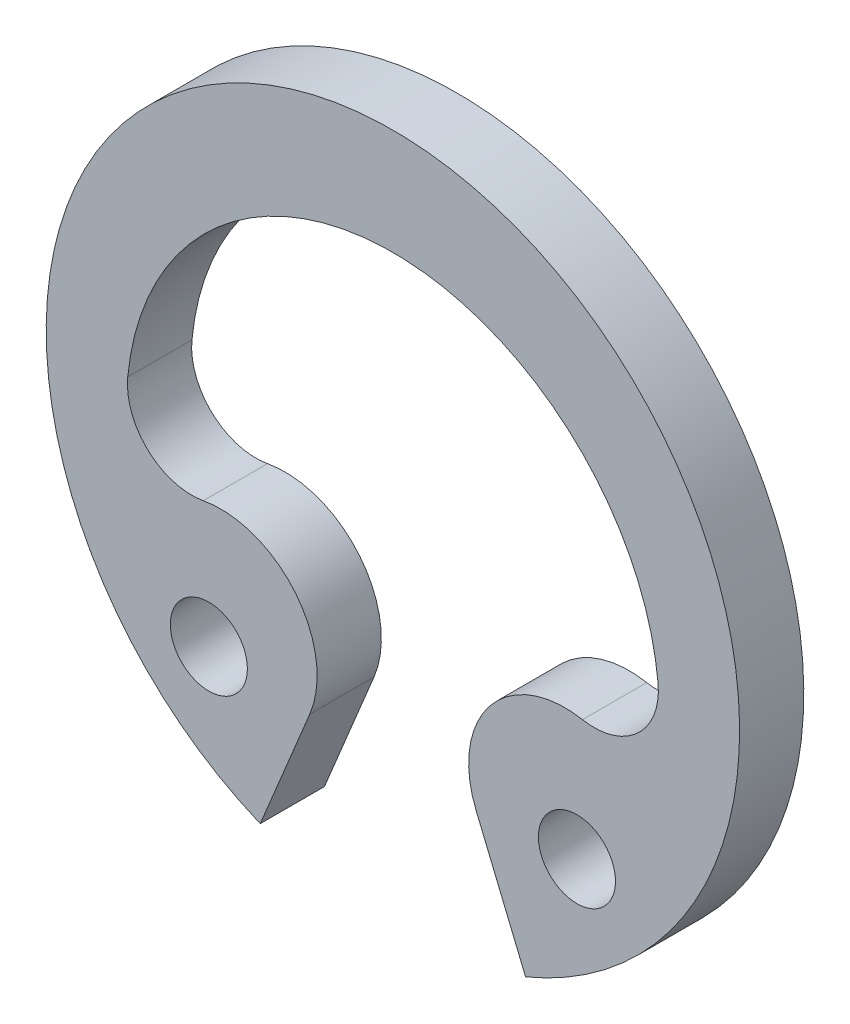
ISO-10303-21;
HEADER;
FILE_DESCRIPTION(('STEP AP214'),'2;1');
FILE_NAME('part.step','',(''),(''),'','','');
FILE_SCHEMA(('AUTOMOTIVE_DESIGN { 1 0 10303 214 1 1 1 1 }'));
ENDSEC;
DATA;
#1=APPLICATION_CONTEXT('core data for automotive mechanical design processes');
#2=APPLICATION_PROTOCOL_DEFINITION('international standard','automotive_design',2000,#1);
#3=PRODUCT_CONTEXT('',#1,'mechanical');
#4=PRODUCT('Part','Part','',(#3));
#5=PRODUCT_RELATED_PRODUCT_CATEGORY('part','',(#4));
#6=PRODUCT_DEFINITION_FORMATION('','',#4);
#7=PRODUCT_DEFINITION_CONTEXT('part definition',#1,'design');
#8=PRODUCT_DEFINITION('design','',#6,#7);
#9=PRODUCT_DEFINITION_SHAPE('','',#8);
#10=(LENGTH_UNIT() NAMED_UNIT(*) SI_UNIT(.MILLI.,.METRE.));
#11=(NAMED_UNIT(*) PLANE_ANGLE_UNIT() SI_UNIT($,.RADIAN.));
#12=(NAMED_UNIT(*) SI_UNIT($,.STERADIAN.) SOLID_ANGLE_UNIT());
#13=UNCERTAINTY_MEASURE_WITH_UNIT(LENGTH_MEASURE(1.E-05),#10,'distance_accuracy_value','');
#14=(GEOMETRIC_REPRESENTATION_CONTEXT(3) GLOBAL_UNCERTAINTY_ASSIGNED_CONTEXT((#13)) GLOBAL_UNIT_ASSIGNED_CONTEXT((#10,
#11,#12)) REPRESENTATION_CONTEXT('',''));
#15=CARTESIAN_POINT('',(0.,0.,0.));
#16=DIRECTION('',(0.,0.,1.));
#17=DIRECTION('',(1.,0.,0.));
#18=AXIS2_PLACEMENT_3D('',#15,#16,#17);
#19=CARTESIAN_POINT('',(-2.6801721145065,-2.55081897370664,1.));
#20=DIRECTION('',(0.,0.,1.));
#21=DIRECTION('',(1.,0.,0.));
#22=AXIS2_PLACEMENT_3D('',#19,#20,#21);
#23=PLANE('',#22);
#24=CARTESIAN_POINT('',(-2.86658661990223,-3.00086340085608,1.));
#25=DIRECTION('',(0.,0.,1.));
#26=DIRECTION('',(1.,0.,0.));
#27=AXIS2_PLACEMENT_3D('',#24,#25,#26);
#28=CIRCLE('',#27,0.6);
#29=CARTESIAN_POINT('',(-2.26658661990223,-3.00086340085608,1.));
#30=VERTEX_POINT('',#29);
#31=EDGE_CURVE('E144',#30,#30,#28,.T.);
#32=ORIENTED_EDGE('',*,*,#31,.F.);
#33=EDGE_LOOP('',(#32));
#34=FACE_BOUND('',#33,.T.);
#35=CARTESIAN_POINT('',(-2.6801721145065,-2.55081897370664,1.));
#36=DIRECTION('',(0.,0.,1.));
#37=DIRECTION('',(1.,0.,0.));
#38=AXIS2_PLACEMENT_3D('',#35,#36,#37);
#39=CIRCLE('',#38,1.5);
#40=CARTESIAN_POINT('',(-1.29435281573957,-3.12484412225427,1.));
#41=VERTEX_POINT('',#40);
#42=CARTESIAN_POINT('',(-2.95304387956165,-1.07584744861347,1.));
#43=VERTEX_POINT('',#42);
#44=EDGE_CURVE('E157',#41,#43,#39,.T.);
#45=ORIENTED_EDGE('',*,*,#44,.T.);
#46=CARTESIAN_POINT('',(-3.13495838959842,-0.0925330985513534,1.));
#47=DIRECTION('',(0.,0.,-1.));
#48=DIRECTION('',(-1.,0.,0.));
#49=AXIS2_PLACEMENT_3D('',#46,#47,#48);
#50=CIRCLE('',#49,0.999999999999996);
#51=CARTESIAN_POINT('',(-4.13018327518522,0.00507544159107008,1.));
#52=VERTEX_POINT('',#51);
#53=EDGE_CURVE('E103',#43,#52,#50,.T.);
#54=ORIENTED_EDGE('',*,*,#53,.T.);
#55=CARTESIAN_POINT('',(0.,-0.4,1.));
#56=DIRECTION('',(0.,0.,-1.));
#57=DIRECTION('',(1.,0.,0.));
#58=AXIS2_PLACEMENT_3D('',#55,#56,#57);
#59=CIRCLE('',#58,4.15);
#60=CARTESIAN_POINT('',(4.13018327518524,0.00507544159106942,1.));
#61=VERTEX_POINT('',#60);
#62=EDGE_CURVE('E172',#52,#61,#59,.T.);
#63=ORIENTED_EDGE('',*,*,#62,.T.);
#64=CARTESIAN_POINT('',(3.13495838959844,-0.0925330985513534,1.));
#65=DIRECTION('',(0.,0.,-1.));
#66=DIRECTION('',(1.,0.,0.));
#67=AXIS2_PLACEMENT_3D('',#64,#65,#66);
#68=CIRCLE('',#67,0.999999999999995);
#69=CARTESIAN_POINT('',(2.95304387956167,-1.07584744861347,1.));
#70=VERTEX_POINT('',#69);
#71=EDGE_CURVE('E185',#61,#70,#68,.T.);
#72=ORIENTED_EDGE('',*,*,#71,.T.);
#73=CARTESIAN_POINT('',(2.68017211450651,-2.55081897370664,1.));
#74=DIRECTION('',(0.,0.,1.));
#75=DIRECTION('',(-1.,0.,0.));
#76=AXIS2_PLACEMENT_3D('',#73,#74,#75);
#77=CIRCLE('',#76,1.5);
#78=CARTESIAN_POINT('',(1.29435281573959,-3.12484412225428,1.));
#79=VERTEX_POINT('',#78);
#80=EDGE_CURVE('E122',#70,#79,#77,.T.);
#81=ORIENTED_EDGE('',*,*,#80,.T.);
#82=DIRECTION('',(0.382683432365093,-0.923879532511285,0.));
#83=VECTOR('',#82,1.);
#84=CARTESIAN_POINT('',(1.29435281573959,-3.12484412225428,1.));
#85=LINE('',#84,#83);
#86=CARTESIAN_POINT('',(2.0664905347715,-4.98894947556094,1.));
#87=VERTEX_POINT('',#86);
#88=EDGE_CURVE('E116',#79,#87,#85,.T.);
#89=ORIENTED_EDGE('',*,*,#88,.T.);
#90=CARTESIAN_POINT('',(0.,0.,1.));
#91=DIRECTION('',(0.,0.,1.));
#92=DIRECTION('',(1.,0.,0.));
#93=AXIS2_PLACEMENT_3D('',#90,#91,#92);
#94=CIRCLE('',#93,5.4);
#95=CARTESIAN_POINT('',(-2.06649053477149,-4.98894947556095,1.));
#96=VERTEX_POINT('',#95);
#97=EDGE_CURVE('E120',#87,#96,#94,.T.);
#98=ORIENTED_EDGE('',*,*,#97,.T.);
#99=DIRECTION('',(0.382683432365091,0.923879532511286,0.));
#100=VECTOR('',#99,1.);
#101=CARTESIAN_POINT('',(-1.29435281573957,-3.12484412225427,1.));
#102=LINE('',#101,#100);
#103=EDGE_CURVE('E60',#96,#41,#102,.T.);
#104=ORIENTED_EDGE('',*,*,#103,.T.);
#105=EDGE_LOOP('',(#45,#54,#63,#72,#81,#89,#98,#104));
#106=FACE_BOUND('',#105,.T.);
#107=CARTESIAN_POINT('',(2.86658661990224,-3.00086340085608,1.));
#108=DIRECTION('',(0.,0.,1.));
#109=DIRECTION('',(-1.,0.,0.));
#110=AXIS2_PLACEMENT_3D('',#107,#108,#109);
#111=CIRCLE('',#110,0.6);
#112=CARTESIAN_POINT('',(2.26658661990224,-3.00086340085608,1.));
#113=VERTEX_POINT('',#112);
#114=EDGE_CURVE('E195',#113,#113,#111,.T.);
#115=ORIENTED_EDGE('',*,*,#114,.F.);
#116=EDGE_LOOP('',(#115));
#117=FACE_BOUND('',#116,.T.);
#118=ADVANCED_FACE('F43',(#34,#106,#117),#23,.T.);
#119=CARTESIAN_POINT('',(-2.6801721145065,-2.55081897370664,0.));
#120=DIRECTION('',(0.,0.,1.));
#121=DIRECTION('',(1.,0.,0.));
#122=AXIS2_PLACEMENT_3D('',#119,#120,#121);
#123=PLANE('',#122);
#124=CARTESIAN_POINT('',(-2.6801721145065,-2.55081897370664,0.));
#125=DIRECTION('',(0.,0.,1.));
#126=DIRECTION('',(1.,0.,0.));
#127=AXIS2_PLACEMENT_3D('',#124,#125,#126);
#128=CIRCLE('',#127,1.5);
#129=CARTESIAN_POINT('',(-1.29435281573957,-3.12484412225427,0.));
#130=VERTEX_POINT('',#129);
#131=CARTESIAN_POINT('',(-2.95304387956165,-1.07584744861347,0.));
#132=VERTEX_POINT('',#131);
#133=EDGE_CURVE('E140',#130,#132,#128,.T.);
#134=ORIENTED_EDGE('',*,*,#133,.F.);
#135=DIRECTION('',(0.382683432365091,0.923879532511286,0.));
#136=VECTOR('',#135,1.);
#137=CARTESIAN_POINT('',(-1.29435281573957,-3.12484412225427,0.));
#138=LINE('',#137,#136);
#139=CARTESIAN_POINT('',(-2.06649053477149,-4.98894947556095,0.));
#140=VERTEX_POINT('',#139);
#141=EDGE_CURVE('E95',#140,#130,#138,.T.);
#142=ORIENTED_EDGE('',*,*,#141,.F.);
#143=CARTESIAN_POINT('',(0.,0.,0.));
#144=DIRECTION('',(0.,0.,1.));
#145=DIRECTION('',(1.,0.,0.));
#146=AXIS2_PLACEMENT_3D('',#143,#144,#145);
#147=CIRCLE('',#146,5.4);
#148=CARTESIAN_POINT('',(2.0664905347715,-4.98894947556094,0.));
#149=VERTEX_POINT('',#148);
#150=EDGE_CURVE('E89',#149,#140,#147,.T.);
#151=ORIENTED_EDGE('',*,*,#150,.F.);
#152=DIRECTION('',(0.382683432365093,-0.923879532511285,0.));
#153=VECTOR('',#152,1.);
#154=CARTESIAN_POINT('',(1.29435281573959,-3.12484412225428,0.));
#155=LINE('',#154,#153);
#156=CARTESIAN_POINT('',(1.29435281573959,-3.12484412225428,0.));
#157=VERTEX_POINT('',#156);
#158=EDGE_CURVE('E130',#157,#149,#155,.T.);
#159=ORIENTED_EDGE('',*,*,#158,.F.);
#160=CARTESIAN_POINT('',(2.68017211450651,-2.55081897370664,0.));
#161=DIRECTION('',(0.,0.,1.));
#162=DIRECTION('',(-1.,0.,0.));
#163=AXIS2_PLACEMENT_3D('',#160,#161,#162);
#164=CIRCLE('',#163,1.5);
#165=CARTESIAN_POINT('',(2.95304387956167,-1.07584744861347,0.));
#166=VERTEX_POINT('',#165);
#167=EDGE_CURVE('E151',#166,#157,#164,.T.);
#168=ORIENTED_EDGE('',*,*,#167,.F.);
#169=CARTESIAN_POINT('',(3.13495838959844,-0.0925330985513534,0.));
#170=DIRECTION('',(0.,0.,-1.));
#171=DIRECTION('',(1.,0.,0.));
#172=AXIS2_PLACEMENT_3D('',#169,#170,#171);
#173=CIRCLE('',#172,0.999999999999995);
#174=CARTESIAN_POINT('',(4.13018327518524,0.00507544159106942,0.));
#175=VERTEX_POINT('',#174);
#176=EDGE_CURVE('E149',#175,#166,#173,.T.);
#177=ORIENTED_EDGE('',*,*,#176,.F.);
#178=CARTESIAN_POINT('',(0.,-0.4,0.));
#179=DIRECTION('',(0.,0.,-1.));
#180=DIRECTION('',(1.,0.,0.));
#181=AXIS2_PLACEMENT_3D('',#178,#179,#180);
#182=CIRCLE('',#181,4.15);
#183=CARTESIAN_POINT('',(-4.13018327518522,0.00507544159107008,0.));
#184=VERTEX_POINT('',#183);
#185=EDGE_CURVE('E146',#184,#175,#182,.T.);
#186=ORIENTED_EDGE('',*,*,#185,.F.);
#187=CARTESIAN_POINT('',(-3.13495838959842,-0.0925330985513534,0.));
#188=DIRECTION('',(0.,0.,-1.));
#189=DIRECTION('',(-1.,0.,0.));
#190=AXIS2_PLACEMENT_3D('',#187,#188,#189);
#191=CIRCLE('',#190,0.999999999999996);
#192=EDGE_CURVE('E143',#132,#184,#191,.T.);
#193=ORIENTED_EDGE('',*,*,#192,.F.);
#194=EDGE_LOOP('',(#134,#142,#151,#159,#168,#177,#186,#193));
#195=FACE_BOUND('',#194,.T.);
#196=CARTESIAN_POINT('',(-2.86658661990223,-3.00086340085608,0.));
#197=DIRECTION('',(0.,0.,1.));
#198=DIRECTION('',(1.,0.,0.));
#199=AXIS2_PLACEMENT_3D('',#196,#197,#198);
#200=CIRCLE('',#199,0.6);
#201=CARTESIAN_POINT('',(-2.26658661990223,-3.00086340085608,0.));
#202=VERTEX_POINT('',#201);
#203=EDGE_CURVE('E192',#202,#202,#200,.T.);
#204=ORIENTED_EDGE('',*,*,#203,.T.);
#205=EDGE_LOOP('',(#204));
#206=FACE_BOUND('',#205,.T.);
#207=CARTESIAN_POINT('',(2.86658661990224,-3.00086340085608,0.));
#208=DIRECTION('',(0.,0.,1.));
#209=DIRECTION('',(-1.,0.,0.));
#210=AXIS2_PLACEMENT_3D('',#207,#208,#209);
#211=CIRCLE('',#210,0.6);
#212=CARTESIAN_POINT('',(2.26658661990224,-3.00086340085608,0.));
#213=VERTEX_POINT('',#212);
#214=EDGE_CURVE('E198',#213,#213,#211,.T.);
#215=ORIENTED_EDGE('',*,*,#214,.T.);
#216=EDGE_LOOP('',(#215));
#217=FACE_BOUND('',#216,.T.);
#218=ADVANCED_FACE('F176',(#195,#206,#217),#123,.F.);
#219=CARTESIAN_POINT('',(-2.6801721145065,-2.55081897370664,1.));
#220=DIRECTION('',(0.,0.,-1.));
#221=DIRECTION('',(-1.,0.,0.));
#222=AXIS2_PLACEMENT_3D('',#219,#220,#221);
#223=CYLINDRICAL_SURFACE('',#222,1.5);
#224=ORIENTED_EDGE('',*,*,#133,.T.);
#225=DIRECTION('',(0.,0.,-1.));
#226=VECTOR('',#225,1.);
#227=CARTESIAN_POINT('',(-2.95304387956165,-1.07584744861347,1.));
#228=LINE('',#227,#226);
#229=EDGE_CURVE('E11',#43,#132,#228,.T.);
#230=ORIENTED_EDGE('',*,*,#229,.F.);
#231=ORIENTED_EDGE('',*,*,#44,.F.);
#232=DIRECTION('',(0.,0.,-1.));
#233=VECTOR('',#232,1.);
#234=CARTESIAN_POINT('',(-1.29435281573957,-3.12484412225427,1.));
#235=LINE('',#234,#233);
#236=EDGE_CURVE('E136',#41,#130,#235,.T.);
#237=ORIENTED_EDGE('',*,*,#236,.T.);
#238=EDGE_LOOP('',(#224,#230,#231,#237));
#239=FACE_BOUND('',#238,.T.);
#240=ADVANCED_FACE('F45',(#239),#223,.T.);
#241=CARTESIAN_POINT('',(-3.13495838959842,-0.0925330985513534,1.));
#242=DIRECTION('',(0.,0.,-1.));
#243=DIRECTION('',(-1.,0.,0.));
#244=AXIS2_PLACEMENT_3D('',#241,#242,#243);
#245=CYLINDRICAL_SURFACE('',#244,0.999999999999996);
#246=ORIENTED_EDGE('',*,*,#192,.T.);
#247=DIRECTION('',(0.,0.,-1.));
#248=VECTOR('',#247,1.);
#249=CARTESIAN_POINT('',(-4.13018327518522,0.00507544159107008,1.));
#250=LINE('',#249,#248);
#251=EDGE_CURVE('E52',#52,#184,#250,.T.);
#252=ORIENTED_EDGE('',*,*,#251,.F.);
#253=ORIENTED_EDGE('',*,*,#53,.F.);
#254=ORIENTED_EDGE('',*,*,#229,.T.);
#255=EDGE_LOOP('',(#246,#252,#253,#254));
#256=FACE_BOUND('',#255,.T.);
#257=ADVANCED_FACE('F230',(#256),#245,.F.);
#258=CARTESIAN_POINT('',(0.,-0.4,1.));
#259=DIRECTION('',(0.,0.,-1.));
#260=DIRECTION('',(-1.,0.,0.));
#261=AXIS2_PLACEMENT_3D('',#258,#259,#260);
#262=CYLINDRICAL_SURFACE('',#261,4.15);
#263=ORIENTED_EDGE('',*,*,#185,.T.);
#264=DIRECTION('',(0.,0.,-1.));
#265=VECTOR('',#264,1.);
#266=CARTESIAN_POINT('',(4.13018327518524,0.00507544159106942,1.));
#267=LINE('',#266,#265);
#268=EDGE_CURVE('E164',#61,#175,#267,.T.);
#269=ORIENTED_EDGE('',*,*,#268,.F.);
#270=ORIENTED_EDGE('',*,*,#62,.F.);
#271=ORIENTED_EDGE('',*,*,#251,.T.);
#272=EDGE_LOOP('',(#263,#269,#270,#271));
#273=FACE_BOUND('',#272,.T.);
#274=ADVANCED_FACE('F170',(#273),#262,.F.);
#275=CARTESIAN_POINT('',(3.13495838959844,-0.0925330985513534,1.));
#276=DIRECTION('',(0.,0.,-1.));
#277=DIRECTION('',(-1.,0.,0.));
#278=AXIS2_PLACEMENT_3D('',#275,#276,#277);
#279=CYLINDRICAL_SURFACE('',#278,0.999999999999995);
#280=ORIENTED_EDGE('',*,*,#176,.T.);
#281=DIRECTION('',(0.,0.,-1.));
#282=VECTOR('',#281,1.);
#283=CARTESIAN_POINT('',(2.95304387956167,-1.07584744861347,1.));
#284=LINE('',#283,#282);
#285=EDGE_CURVE('E161',#70,#166,#284,.T.);
#286=ORIENTED_EDGE('',*,*,#285,.F.);
#287=ORIENTED_EDGE('',*,*,#71,.F.);
#288=ORIENTED_EDGE('',*,*,#268,.T.);
#289=EDGE_LOOP('',(#280,#286,#287,#288));
#290=FACE_BOUND('',#289,.T.);
#291=ADVANCED_FACE('F181',(#290),#279,.F.);
#292=CARTESIAN_POINT('',(2.68017211450651,-2.55081897370664,1.));
#293=DIRECTION('',(0.,0.,-1.));
#294=DIRECTION('',(-1.,0.,0.));
#295=AXIS2_PLACEMENT_3D('',#292,#293,#294);
#296=CYLINDRICAL_SURFACE('',#295,1.5);
#297=ORIENTED_EDGE('',*,*,#167,.T.);
#298=DIRECTION('',(0.,0.,-1.));
#299=VECTOR('',#298,1.);
#300=CARTESIAN_POINT('',(1.29435281573959,-3.12484412225428,1.));
#301=LINE('',#300,#299);
#302=EDGE_CURVE('E131',#79,#157,#301,.T.);
#303=ORIENTED_EDGE('',*,*,#302,.F.);
#304=ORIENTED_EDGE('',*,*,#80,.F.);
#305=ORIENTED_EDGE('',*,*,#285,.T.);
#306=EDGE_LOOP('',(#297,#303,#304,#305));
#307=FACE_BOUND('',#306,.T.);
#308=ADVANCED_FACE('F184',(#307),#296,.T.);
#309=CARTESIAN_POINT('',(1.29435281573959,-3.12484412225428,1.));
#310=DIRECTION('',(0.923879532511285,0.382683432365093,0.));
#311=DIRECTION('',(-0.382683432365093,0.923879532511285,0.));
#312=AXIS2_PLACEMENT_3D('',#309,#310,#311);
#313=PLANE('',#312);
#314=ORIENTED_EDGE('',*,*,#158,.T.);
#315=DIRECTION('',(0.,0.,-1.));
#316=VECTOR('',#315,1.);
#317=CARTESIAN_POINT('',(2.0664905347715,-4.98894947556094,1.));
#318=LINE('',#317,#316);
#319=EDGE_CURVE('E127',#87,#149,#318,.T.);
#320=ORIENTED_EDGE('',*,*,#319,.F.);
#321=ORIENTED_EDGE('',*,*,#88,.F.);
#322=ORIENTED_EDGE('',*,*,#302,.T.);
#323=EDGE_LOOP('',(#314,#320,#321,#322));
#324=FACE_BOUND('',#323,.T.);
#325=ADVANCED_FACE('F128',(#324),#313,.F.);
#326=CARTESIAN_POINT('',(0.,0.,1.));
#327=DIRECTION('',(0.,0.,-1.));
#328=DIRECTION('',(-1.,0.,0.));
#329=AXIS2_PLACEMENT_3D('',#326,#327,#328);
#330=CYLINDRICAL_SURFACE('',#329,5.4);
#331=ORIENTED_EDGE('',*,*,#150,.T.);
#332=DIRECTION('',(0.,0.,-1.));
#333=VECTOR('',#332,1.);
#334=CARTESIAN_POINT('',(-2.06649053477149,-4.98894947556095,1.));
#335=LINE('',#334,#333);
#336=EDGE_CURVE('E132',#96,#140,#335,.T.);
#337=ORIENTED_EDGE('',*,*,#336,.F.);
#338=ORIENTED_EDGE('',*,*,#97,.F.);
#339=ORIENTED_EDGE('',*,*,#319,.T.);
#340=EDGE_LOOP('',(#331,#337,#338,#339));
#341=FACE_BOUND('',#340,.T.);
#342=ADVANCED_FACE('F134',(#341),#330,.T.);
#343=CARTESIAN_POINT('',(-1.29435281573957,-3.12484412225427,1.));
#344=DIRECTION('',(-0.923879532511286,0.382683432365091,0.));
#345=DIRECTION('',(-0.382683432365091,-0.923879532511286,0.));
#346=AXIS2_PLACEMENT_3D('',#343,#344,#345);
#347=PLANE('',#346);
#348=ORIENTED_EDGE('',*,*,#141,.T.);
#349=ORIENTED_EDGE('',*,*,#236,.F.);
#350=ORIENTED_EDGE('',*,*,#103,.F.);
#351=ORIENTED_EDGE('',*,*,#336,.T.);
#352=EDGE_LOOP('',(#348,#349,#350,#351));
#353=FACE_BOUND('',#352,.T.);
#354=ADVANCED_FACE('F218',(#353),#347,.F.);
#355=CARTESIAN_POINT('',(-2.86658661990223,-3.00086340085608,1.));
#356=DIRECTION('',(0.,0.,-1.));
#357=DIRECTION('',(-1.,0.,0.));
#358=AXIS2_PLACEMENT_3D('',#355,#356,#357);
#359=CYLINDRICAL_SURFACE('',#358,0.6);
#360=ORIENTED_EDGE('',*,*,#31,.T.);
#361=EDGE_LOOP('',(#360));
#362=FACE_BOUND('',#361,.T.);
#363=ORIENTED_EDGE('',*,*,#203,.F.);
#364=EDGE_LOOP('',(#363));
#365=FACE_BOUND('',#364,.T.);
#366=ADVANCED_FACE('F215',(#362,#365),#359,.F.);
#367=CARTESIAN_POINT('',(2.86658661990224,-3.00086340085608,1.));
#368=DIRECTION('',(0.,0.,-1.));
#369=DIRECTION('',(-1.,0.,0.));
#370=AXIS2_PLACEMENT_3D('',#367,#368,#369);
#371=CYLINDRICAL_SURFACE('',#370,0.6);
#372=ORIENTED_EDGE('',*,*,#114,.T.);
#373=EDGE_LOOP('',(#372));
#374=FACE_BOUND('',#373,.T.);
#375=ORIENTED_EDGE('',*,*,#214,.F.);
#376=EDGE_LOOP('',(#375));
#377=FACE_BOUND('',#376,.T.);
#378=ADVANCED_FACE('F204',(#374,#377),#371,.F.);
#379=CLOSED_SHELL('',(#118,#218,#240,#257,#274,#291,#308,#325,#342,#354,#366,#378));
#380=MANIFOLD_SOLID_BREP('B2',#379);
#381=ADVANCED_BREP_SHAPE_REPRESENTATION('',(#18,#380),#14);
#382=SHAPE_DEFINITION_REPRESENTATION(#9,#381);
ENDSEC;
END-ISO-10303-21;
